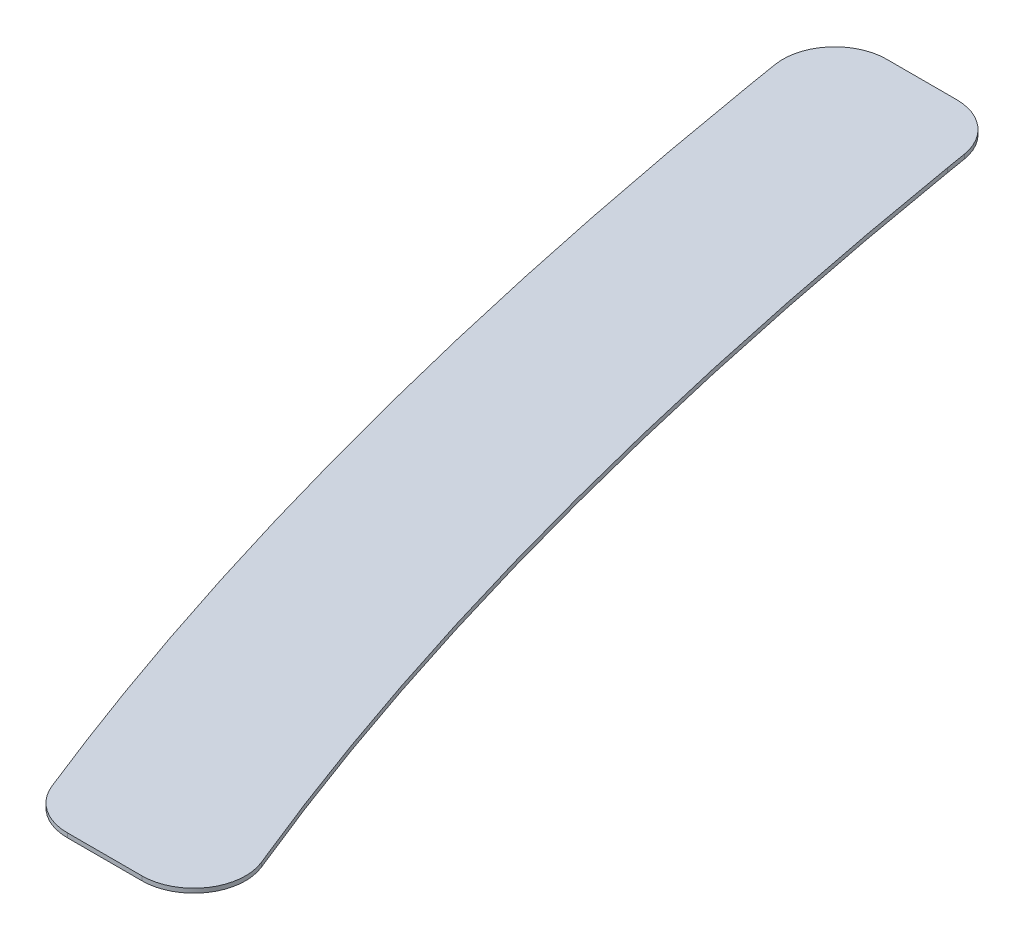
ISO-10303-21;
HEADER;
FILE_DESCRIPTION(('STEP AP214'),'2;1');
FILE_NAME('part.step','',(''),(''),'','','');
FILE_SCHEMA(('AUTOMOTIVE_DESIGN { 1 0 10303 214 1 1 1 1 }'));
ENDSEC;
DATA;
#1=APPLICATION_CONTEXT('core data for automotive mechanical design processes');
#2=APPLICATION_PROTOCOL_DEFINITION('international standard','automotive_design',2000,#1);
#3=PRODUCT_CONTEXT('',#1,'mechanical');
#4=PRODUCT('Part','Part','',(#3));
#5=PRODUCT_RELATED_PRODUCT_CATEGORY('part','',(#4));
#6=PRODUCT_DEFINITION_FORMATION('','',#4);
#7=PRODUCT_DEFINITION_CONTEXT('part definition',#1,'design');
#8=PRODUCT_DEFINITION('design','',#6,#7);
#9=PRODUCT_DEFINITION_SHAPE('','',#8);
#10=(LENGTH_UNIT() NAMED_UNIT(*) SI_UNIT(.MILLI.,.METRE.));
#11=(NAMED_UNIT(*) PLANE_ANGLE_UNIT() SI_UNIT($,.RADIAN.));
#12=(NAMED_UNIT(*) SI_UNIT($,.STERADIAN.) SOLID_ANGLE_UNIT());
#13=UNCERTAINTY_MEASURE_WITH_UNIT(LENGTH_MEASURE(1.E-05),#10,'distance_accuracy_value','');
#14=(GEOMETRIC_REPRESENTATION_CONTEXT(3) GLOBAL_UNCERTAINTY_ASSIGNED_CONTEXT((#13)) GLOBAL_UNIT_ASSIGNED_CONTEXT((#10,
#11,#12)) REPRESENTATION_CONTEXT('',''));
#15=CARTESIAN_POINT('',(0.,0.,0.));
#16=DIRECTION('',(0.,0.,1.));
#17=DIRECTION('',(1.,0.,0.));
#18=AXIS2_PLACEMENT_3D('',#15,#16,#17);
#19=CARTESIAN_POINT('',(856.4780050382,505.5,568.));
#20=DIRECTION('',(0.,1.,0.));
#21=DIRECTION('',(0.,0.,-1.));
#22=AXIS2_PLACEMENT_3D('',#19,#20,#21);
#23=CYLINDRICAL_SURFACE('',#22,12.);
#24=CARTESIAN_POINT('',(856.4780050382,505.,568.));
#25=DIRECTION('',(0.,-1.,0.));
#26=DIRECTION('',(0.,0.,-1.));
#27=AXIS2_PLACEMENT_3D('',#24,#25,#26);
#28=CIRCLE('',#27,12.);
#29=CARTESIAN_POINT('',(856.4780050382,505.,580.));
#30=VERTEX_POINT('',#29);
#31=CARTESIAN_POINT('',(845.340909306832,505.,572.468232163879));
#32=VERTEX_POINT('',#31);
#33=EDGE_CURVE('E67',#30,#32,#28,.T.);
#34=ORIENTED_EDGE('',*,*,#33,.F.);
#35=DIRECTION('',(0.,-1.,0.));
#36=VECTOR('',#35,1.);
#37=CARTESIAN_POINT('',(856.4780050382,505.,580.));
#38=LINE('',#37,#36);
#39=CARTESIAN_POINT('',(856.4780050382,506.,580.));
#40=VERTEX_POINT('',#39);
#41=EDGE_CURVE('E170',#40,#30,#38,.T.);
#42=ORIENTED_EDGE('',*,*,#41,.F.);
#43=CARTESIAN_POINT('',(856.4780050382,506.,568.));
#44=DIRECTION('',(0.,1.,0.));
#45=DIRECTION('',(0.,0.,-1.));
#46=AXIS2_PLACEMENT_3D('',#43,#44,#45);
#47=CIRCLE('',#46,12.);
#48=CARTESIAN_POINT('',(845.340909306832,506.,572.468232163879));
#49=VERTEX_POINT('',#48);
#50=EDGE_CURVE('E163',#49,#40,#47,.T.);
#51=ORIENTED_EDGE('',*,*,#50,.F.);
#52=DIRECTION('',(0.,1.,0.));
#53=VECTOR('',#52,1.);
#54=CARTESIAN_POINT('',(845.340909306832,506.,572.46823216388));
#55=LINE('',#54,#53);
#56=EDGE_CURVE('E197',#32,#49,#55,.T.);
#57=ORIENTED_EDGE('',*,*,#56,.F.);
#58=EDGE_LOOP('',(#34,#42,#51,#57));
#59=FACE_BOUND('',#58,.T.);
#60=ADVANCED_FACE('F17',(#59),#23,.T.);
#61=CARTESIAN_POINT('',(873.746285877886,505.5,568.));
#62=DIRECTION('',(0.,1.,0.));
#63=DIRECTION('',(0.,0.,-1.));
#64=AXIS2_PLACEMENT_3D('',#61,#62,#63);
#65=CYLINDRICAL_SURFACE('',#64,12.);
#66=CARTESIAN_POINT('',(873.746285877886,505.,568.));
#67=DIRECTION('',(0.,-1.,0.));
#68=DIRECTION('',(0.,0.,-1.));
#69=AXIS2_PLACEMENT_3D('',#66,#67,#68);
#70=CIRCLE('',#69,12.);
#71=CARTESIAN_POINT('',(884.845891222246,505.,563.439434114119));
#72=VERTEX_POINT('',#71);
#73=CARTESIAN_POINT('',(873.746285877886,505.,580.));
#74=VERTEX_POINT('',#73);
#75=EDGE_CURVE('E173',#72,#74,#70,.T.);
#76=ORIENTED_EDGE('',*,*,#75,.F.);
#77=DIRECTION('',(0.,-1.,0.));
#78=VECTOR('',#77,1.);
#79=CARTESIAN_POINT('',(884.845891222246,505.,563.439434114119));
#80=LINE('',#79,#78);
#81=CARTESIAN_POINT('',(884.845891222246,506.,563.439434114119));
#82=VERTEX_POINT('',#81);
#83=EDGE_CURVE('E185',#82,#72,#80,.T.);
#84=ORIENTED_EDGE('',*,*,#83,.F.);
#85=CARTESIAN_POINT('',(873.746285877886,506.,568.));
#86=DIRECTION('',(0.,1.,0.));
#87=DIRECTION('',(0.,0.,-1.));
#88=AXIS2_PLACEMENT_3D('',#85,#86,#87);
#89=CIRCLE('',#88,12.);
#90=CARTESIAN_POINT('',(873.746285877886,506.,580.));
#91=VERTEX_POINT('',#90);
#92=EDGE_CURVE('E82',#91,#82,#89,.T.);
#93=ORIENTED_EDGE('',*,*,#92,.F.);
#94=DIRECTION('',(0.,1.,0.));
#95=VECTOR('',#94,1.);
#96=CARTESIAN_POINT('',(873.746285877886,505.,580.));
#97=LINE('',#96,#95);
#98=EDGE_CURVE('E169',#74,#91,#97,.T.);
#99=ORIENTED_EDGE('',*,*,#98,.F.);
#100=EDGE_LOOP('',(#76,#84,#93,#99));
#101=FACE_BOUND('',#100,.T.);
#102=ADVANCED_FACE('F439',(#101),#65,.T.);
#103=CARTESIAN_POINT('',(796.177472469818,505.5,342.));
#104=DIRECTION('',(0.,1.,0.));
#105=DIRECTION('',(0.,0.,-1.));
#106=AXIS2_PLACEMENT_3D('',#103,#104,#105);
#107=CYLINDRICAL_SURFACE('',#106,12.);
#108=CARTESIAN_POINT('',(796.177472469818,505.,342.));
#109=DIRECTION('',(0.,-1.,0.));
#110=DIRECTION('',(0.,0.,-1.));
#111=AXIS2_PLACEMENT_3D('',#108,#109,#110);
#112=CIRCLE('',#111,12.);
#113=CARTESIAN_POINT('',(784.334733832996,505.,343.936373305935));
#114=VERTEX_POINT('',#113);
#115=CARTESIAN_POINT('',(796.177472469818,505.,330.));
#116=VERTEX_POINT('',#115);
#117=EDGE_CURVE('E31',#114,#116,#112,.T.);
#118=ORIENTED_EDGE('',*,*,#117,.F.);
#119=DIRECTION('',(0.,-1.,0.));
#120=VECTOR('',#119,1.);
#121=CARTESIAN_POINT('',(784.334733832994,505.,343.936373305921));
#122=LINE('',#121,#120);
#123=CARTESIAN_POINT('',(784.334733832996,506.,343.936373305935));
#124=VERTEX_POINT('',#123);
#125=EDGE_CURVE('E153',#124,#114,#122,.T.);
#126=ORIENTED_EDGE('',*,*,#125,.F.);
#127=CARTESIAN_POINT('',(796.177472469818,506.,342.));
#128=DIRECTION('',(0.,1.,0.));
#129=DIRECTION('',(0.,0.,-1.));
#130=AXIS2_PLACEMENT_3D('',#127,#128,#129);
#131=CIRCLE('',#130,12.);
#132=CARTESIAN_POINT('',(796.177472469818,506.,330.));
#133=VERTEX_POINT('',#132);
#134=EDGE_CURVE('E123',#133,#124,#131,.T.);
#135=ORIENTED_EDGE('',*,*,#134,.F.);
#136=DIRECTION('',(0.,1.,0.));
#137=VECTOR('',#136,1.);
#138=CARTESIAN_POINT('',(796.177472469818,505.,330.));
#139=LINE('',#138,#137);
#140=EDGE_CURVE('E141',#116,#133,#139,.T.);
#141=ORIENTED_EDGE('',*,*,#140,.F.);
#142=EDGE_LOOP('',(#118,#126,#135,#141));
#143=FACE_BOUND('',#142,.T.);
#144=ADVANCED_FACE('F142',(#143),#107,.T.);
#145=CARTESIAN_POINT('',(812.392486616481,505.5,342.));
#146=DIRECTION('',(0.,1.,0.));
#147=DIRECTION('',(0.,0.,-1.));
#148=AXIS2_PLACEMENT_3D('',#145,#146,#147);
#149=CYLINDRICAL_SURFACE('',#148,12.);
#150=CARTESIAN_POINT('',(812.392486616481,505.,342.));
#151=DIRECTION('',(0.,-1.,0.));
#152=DIRECTION('',(0.,0.,-1.));
#153=AXIS2_PLACEMENT_3D('',#150,#151,#152);
#154=CIRCLE('',#153,12.);
#155=CARTESIAN_POINT('',(812.392486616481,505.,330.));
#156=VERTEX_POINT('',#155);
#157=CARTESIAN_POINT('',(824.23152550379,505.,340.041133433649));
#158=VERTEX_POINT('',#157);
#159=EDGE_CURVE('E11',#156,#158,#154,.T.);
#160=ORIENTED_EDGE('',*,*,#159,.F.);
#161=DIRECTION('',(0.,-1.,0.));
#162=VECTOR('',#161,1.);
#163=CARTESIAN_POINT('',(812.392486616481,505.,330.));
#164=LINE('',#163,#162);
#165=CARTESIAN_POINT('',(812.392486616481,506.,330.));
#166=VERTEX_POINT('',#165);
#167=EDGE_CURVE('E151',#166,#156,#164,.T.);
#168=ORIENTED_EDGE('',*,*,#167,.F.);
#169=CARTESIAN_POINT('',(812.392486616481,506.,342.));
#170=DIRECTION('',(0.,1.,0.));
#171=DIRECTION('',(0.,0.,-1.));
#172=AXIS2_PLACEMENT_3D('',#169,#170,#171);
#173=CIRCLE('',#172,12.);
#174=CARTESIAN_POINT('',(824.23152550379,506.,340.041133433649));
#175=VERTEX_POINT('',#174);
#176=EDGE_CURVE('E171',#175,#166,#173,.T.);
#177=ORIENTED_EDGE('',*,*,#176,.F.);
#178=DIRECTION('',(0.,1.,0.));
#179=VECTOR('',#178,1.);
#180=CARTESIAN_POINT('',(824.231525503791,506.,340.041133433649));
#181=LINE('',#180,#179);
#182=EDGE_CURVE('E191',#158,#175,#181,.T.);
#183=ORIENTED_EDGE('',*,*,#182,.F.);
#184=EDGE_LOOP('',(#160,#168,#177,#183));
#185=FACE_BOUND('',#184,.T.);
#186=ADVANCED_FACE('F422',(#185),#149,.T.);
#187=CARTESIAN_POINT('',(0.,505.,0.));
#188=DIRECTION('',(0.,1.,0.));
#189=DIRECTION('',(1.,0.,0.));
#190=AXIS2_PLACEMENT_3D('',#187,#188,#189);
#191=PLANE('',#190);
#192=CARTESIAN_POINT('',(825.006522365139,505.,344.676532488364));
#193=CARTESIAN_POINT('',(820.180034677245,505.,316.105799526349));
#194=CARTESIAN_POINT('',(815.273194099068,505.,280.231997901681));
#195=CARTESIAN_POINT('',(811.106266200122,505.,240.611100509871));
#196=CARTESIAN_POINT('',(809.718658077188,505.,226.178693766515));
#197=CARTESIAN_POINT('',(806.891459268486,505.,194.858973003472));
#198=CARTESIAN_POINT('',(804.168238169567,505.,155.199510505898));
#199=CARTESIAN_POINT('',(802.317524885658,505.,114.284098854535));
#200=CARTESIAN_POINT('',(801.473615525855,505.,90.2725977588578));
#201=CARTESIAN_POINT('',(801.133355185038,505.,78.1971238869387));
#202=CARTESIAN_POINT('',(800.958659812526,505.,70.9622323715767));
#203=B_SPLINE_CURVE_WITH_KNOTS('',3,(#192,#193,#194,#195,#196,#197,#198,#199,#200,#201,#202),
.UNSPECIFIED.,.F.,.F.,(4,1,1,1,1,1,1,1,4),(0.,0.316086158119462,0.394843191255499,
0.434611216199119,0.474254730428439,0.737897375698214,0.868215493286134,0.921051376030962,1.),.UNSPECIFIED.);
#204=CARTESIAN_POINT('',(825.006522365139,505.,344.676532488364));
#205=VERTEX_POINT('',#204);
#206=EDGE_CURVE('E205',#205,#158,#203,.T.);
#207=ORIENTED_EDGE('',*,*,#206,.F.);
#208=CARTESIAN_POINT('',(1003.47790187698,505.,750.));
#209=CARTESIAN_POINT('',(992.105926782801,505.,738.23099025863));
#210=CARTESIAN_POINT('',(977.346769521141,505.,721.399321829088));
#211=CARTESIAN_POINT('',(956.39364097684,505.,694.171473634577));
#212=CARTESIAN_POINT('',(939.320335597391,505.,669.51622660218));
#213=CARTESIAN_POINT('',(923.844740427881,505.,643.841311183101));
#214=CARTESIAN_POINT('',(910.490682875014,505.,619.304553189258));
#215=CARTESIAN_POINT('',(900.72435084607,505.,599.640127057022));
#216=CARTESIAN_POINT('',(892.477568878219,505.,581.473019758271));
#217=CARTESIAN_POINT('',(887.357800806862,505.,569.541557639466));
#218=CARTESIAN_POINT('',(883.558054688417,505.,560.331774609759));
#219=CARTESIAN_POINT('',(872.863834634074,505.,533.518021096127));
#220=CARTESIAN_POINT('',(861.558508139477,505.,500.521160412346));
#221=CARTESIAN_POINT('',(851.105430867338,505.,464.155658786559));
#222=CARTESIAN_POINT('',(845.774013518538,505.,443.954609379996));
#223=CARTESIAN_POINT('',(841.486505540497,505.,426.544472916345));
#224=CARTESIAN_POINT('',(837.483450045872,505.,409.103183332899));
#225=CARTESIAN_POINT('',(833.747456429881,505.,391.621543043858));
#226=CARTESIAN_POINT('',(830.651391723599,505.,376.045663642099));
#227=CARTESIAN_POINT('',(828.273533808435,505.,363.324582214981));
#228=CARTESIAN_POINT('',(826.514492213466,505.,353.489713475438));
#229=CARTESIAN_POINT('',(825.502071576371,505.,347.609970859946));
#230=CARTESIAN_POINT('',(825.006522365139,505.,344.676532488364));
#231=B_SPLINE_CURVE_WITH_KNOTS('',3,(#208,#209,#210,#211,#212,#213,#214,#215,#216,#217,#218,
#219,#220,#221,#222,#223,#224,#225,#226,#227,#228,#229,#230),.UNSPECIFIED.,.F.,.F.,(4,1,1,1,1,1,
1,1,1,1,1,1,1,1,1,1,1,1,1,1,4),(0.,0.109174858766859,0.149174964749524,0.229168613912527,
0.309131138817732,0.349071219994264,0.415514063503558,0.455564034482648,0.482162996773735,
0.50212403697991,0.522032873874803,0.674720927832937,0.734641938065071,0.774442584330625,
0.814093217953892,0.854257193247291,0.893818382109767,0.933348395325739,0.960197672090086,
0.980153045954644,1.),.UNSPECIFIED.);
#232=EDGE_CURVE('E22',#72,#205,#231,.T.);
#233=ORIENTED_EDGE('',*,*,#232,.F.);
#234=ORIENTED_EDGE('',*,*,#75,.T.);
#235=DIRECTION('',(1.,0.,0.));
#236=VECTOR('',#235,1.);
#237=CARTESIAN_POINT('',(0.,505.,580.));
#238=LINE('',#237,#236);
#239=EDGE_CURVE('E165',#30,#74,#238,.T.);
#240=ORIENTED_EDGE('',*,*,#239,.F.);
#241=ORIENTED_EDGE('',*,*,#33,.T.);
#242=CARTESIAN_POINT('',(785.565207915593,505.,351.339849535134));
#243=CARTESIAN_POINT('',(788.978424366858,505.,371.541131576573));
#244=CARTESIAN_POINT('',(794.359907220215,505.,399.763628532244));
#245=CARTESIAN_POINT('',(802.080298613391,505.,433.808652235915));
#246=CARTESIAN_POINT('',(807.010345899914,505.,453.831651078258));
#247=CARTESIAN_POINT('',(811.756904933394,505.,471.814735959559));
#248=CARTESIAN_POINT('',(816.258267212226,505.,487.736915010618));
#249=CARTESIAN_POINT('',(821.013206386271,505.,503.624479559208));
#250=CARTESIAN_POINT('',(826.037331500085,505.,519.493232672379));
#251=CARTESIAN_POINT('',(831.386466490733,505.,535.280580154532));
#252=CARTESIAN_POINT('',(835.961614997108,505.,548.041779910277));
#253=CARTESIAN_POINT('',(839.606242102918,505.,557.816290796022));
#254=CARTESIAN_POINT('',(845.299994293779,505.,572.580742200096));
#255=CARTESIAN_POINT('',(854.705502760165,505.,595.38274812104));
#256=CARTESIAN_POINT('',(864.878708233502,505.,617.371719998699));
#257=CARTESIAN_POINT('',(875.732647086845,505.,639.028907763579));
#258=CARTESIAN_POINT('',(883.021464626893,505.,652.65793836365));
#259=CARTESIAN_POINT('',(890.950116031723,505.,666.49211748031));
#260=CARTESIAN_POINT('',(895.844019837568,505.,674.741572245518));
#261=CARTESIAN_POINT('',(900.870928336081,505.,682.928791147231));
#262=CARTESIAN_POINT('',(906.026129482516,505.,691.040701027744));
#263=CARTESIAN_POINT('',(910.730648345717,505.,698.191566717435));
#264=CARTESIAN_POINT('',(915.533414579631,505.,705.283306887266));
#265=CARTESIAN_POINT('',(920.439413386482,505.,712.320573569399));
#266=CARTESIAN_POINT('',(927.357452401453,505.,721.903253368827));
#267=CARTESIAN_POINT('',(935.596348013565,505.,732.796931963177));
#268=CARTESIAN_POINT('',(943.517373824289,505.,742.692036027472));
#269=CARTESIAN_POINT('',(948.181651482879,505.,748.290896013329));
#270=CARTESIAN_POINT('',(949.622839074963,505.,750.));
#271=B_SPLINE_CURVE_WITH_KNOTS('',3,(#242,#243,#244,#245,#246,#247,#248,#249,#250,#251,#252,
#253,#254,#255,#256,#257,#258,#259,#260,#261,#262,#263,#264,#265,#266,#267,#268,#269,#270),
.UNSPECIFIED.,.F.,.F.,(4,1,1,1,1,1,1,1,1,1,1,1,1,1,1,1,1,1,1,1,1,1,1,1,1,1,4),(0.,
0.140881836545801,0.197509325668819,0.240035354624321,0.282674852842225,0.325397505972841,
0.353808608072153,0.396709101608331,0.439849572446622,0.468423989990071,0.48992619063109,
0.511582214469632,0.577235121913066,0.659507952993129,0.678132978355615,0.743810600181206,
0.765760360596102,0.787773712648991,0.809766139114279,0.831821453454349,0.853863286563152,
0.86862326786588,0.890716708241395,0.912850562919186,0.949891724556924,0.98462698273928,1.),.UNSPECIFIED.);
#272=CARTESIAN_POINT('',(785.565207915593,505.,351.339849535134));
#273=VERTEX_POINT('',#272);
#274=EDGE_CURVE('E201',#273,#32,#271,.T.);
#275=ORIENTED_EDGE('',*,*,#274,.F.);
#276=CARTESIAN_POINT('',(760.569499720048,505.,52.5601810505374));
#277=CARTESIAN_POINT('',(761.091505341413,505.,82.6829114913813));
#278=CARTESIAN_POINT('',(762.432290422846,505.,123.425369651162));
#279=CARTESIAN_POINT('',(765.217645154549,505.,170.811171866914));
#280=CARTESIAN_POINT('',(766.724623605165,505.,192.135662672798));
#281=CARTESIAN_POINT('',(770.306874271752,505.,237.764615563687));
#282=CARTESIAN_POINT('',(775.340366220356,505.,284.667949879056));
#283=CARTESIAN_POINT('',(781.990567226446,505.,329.322734262035));
#284=CARTESIAN_POINT('',(784.118831957731,505.,342.658805357965));
#285=CARTESIAN_POINT('',(785.00130578463,505.,348.002368260799));
#286=CARTESIAN_POINT('',(785.565207915593,505.,351.339849535134));
#287=B_SPLINE_CURVE_WITH_KNOTS('',3,(#276,#277,#278,#279,#280,#281,#282,#283,#284,#285,#286),
.UNSPECIFIED.,.F.,.F.,(4,1,1,1,1,1,1,1,4),(0.,0.301175313927396,0.407439214767169,
0.474505160891021,0.514874093629566,0.864991867765046,0.945862406011145,0.966162130211192,1.),.UNSPECIFIED.);
#288=EDGE_CURVE('E136',#114,#273,#287,.T.);
#289=ORIENTED_EDGE('',*,*,#288,.F.);
#290=ORIENTED_EDGE('',*,*,#117,.T.);
#291=DIRECTION('',(-1.,0.,0.));
#292=VECTOR('',#291,1.);
#293=CARTESIAN_POINT('',(0.,505.,330.));
#294=LINE('',#293,#292);
#295=EDGE_CURVE('E134',#156,#116,#294,.T.);
#296=ORIENTED_EDGE('',*,*,#295,.F.);
#297=ORIENTED_EDGE('',*,*,#159,.T.);
#298=EDGE_LOOP('',(#207,#233,#234,#240,#241,#275,#289,#290,#296,#297));
#299=FACE_BOUND('',#298,.T.);
#300=ADVANCED_FACE('F132',(#299),#191,.F.);
#301=CARTESIAN_POINT('',(0.,506.,0.));
#302=DIRECTION('',(0.,1.,0.));
#303=DIRECTION('',(1.,0.,0.));
#304=AXIS2_PLACEMENT_3D('',#301,#302,#303);
#305=PLANE('',#304);
#306=DIRECTION('',(-1.,0.,0.));
#307=VECTOR('',#306,1.);
#308=CARTESIAN_POINT('',(0.,506.,330.));
#309=LINE('',#308,#307);
#310=EDGE_CURVE('E146',#166,#133,#309,.T.);
#311=ORIENTED_EDGE('',*,*,#310,.T.);
#312=ORIENTED_EDGE('',*,*,#134,.T.);
#313=CARTESIAN_POINT('',(760.569499720048,506.,52.5601810505374));
#314=CARTESIAN_POINT('',(761.091505341413,506.,82.6829114913813));
#315=CARTESIAN_POINT('',(762.432290422846,506.,123.425369651162));
#316=CARTESIAN_POINT('',(765.217645154549,506.,170.811171866914));
#317=CARTESIAN_POINT('',(766.724623605165,506.,192.135662672798));
#318=CARTESIAN_POINT('',(770.306874271752,506.,237.764615563687));
#319=CARTESIAN_POINT('',(775.340366220356,506.,284.667949879056));
#320=CARTESIAN_POINT('',(781.990567226446,506.,329.322734262035));
#321=CARTESIAN_POINT('',(784.118831957731,506.,342.658805357965));
#322=CARTESIAN_POINT('',(785.00130578463,506.,348.002368260799));
#323=CARTESIAN_POINT('',(785.565207915593,506.,351.339849535134));
#324=B_SPLINE_CURVE_WITH_KNOTS('',3,(#313,#314,#315,#316,#317,#318,#319,#320,#321,#322,#323),
.UNSPECIFIED.,.F.,.F.,(4,1,1,1,1,1,1,1,4),(0.,0.301175313927396,0.407439214767169,
0.474505160891021,0.514874093629566,0.864991867765046,0.945862406011145,0.966162130211192,1.),.UNSPECIFIED.);
#325=CARTESIAN_POINT('',(785.565207915593,506.,351.339849535134));
#326=VERTEX_POINT('',#325);
#327=EDGE_CURVE('E159',#124,#326,#324,.T.);
#328=ORIENTED_EDGE('',*,*,#327,.T.);
#329=CARTESIAN_POINT('',(785.565207915593,506.,351.339849535134));
#330=CARTESIAN_POINT('',(788.978424366858,506.,371.541131576573));
#331=CARTESIAN_POINT('',(794.359907220215,506.,399.763628532244));
#332=CARTESIAN_POINT('',(802.080298613391,506.,433.808652235915));
#333=CARTESIAN_POINT('',(807.010345899914,506.,453.831651078258));
#334=CARTESIAN_POINT('',(811.756904933394,506.,471.814735959559));
#335=CARTESIAN_POINT('',(816.258267212226,506.,487.736915010618));
#336=CARTESIAN_POINT('',(821.013206386271,506.,503.624479559208));
#337=CARTESIAN_POINT('',(826.037331500085,506.,519.493232672379));
#338=CARTESIAN_POINT('',(831.386466490733,506.,535.280580154532));
#339=CARTESIAN_POINT('',(835.961614997108,506.,548.041779910277));
#340=CARTESIAN_POINT('',(839.606242102918,506.,557.816290796022));
#341=CARTESIAN_POINT('',(845.299994293779,506.,572.580742200096));
#342=CARTESIAN_POINT('',(854.705502760165,506.,595.38274812104));
#343=CARTESIAN_POINT('',(864.878708233502,506.,617.371719998699));
#344=CARTESIAN_POINT('',(875.732647086845,506.,639.028907763579));
#345=CARTESIAN_POINT('',(883.021464626893,506.,652.65793836365));
#346=CARTESIAN_POINT('',(890.950116031723,506.,666.49211748031));
#347=CARTESIAN_POINT('',(895.844019837568,506.,674.741572245518));
#348=CARTESIAN_POINT('',(900.870928336081,506.,682.928791147231));
#349=CARTESIAN_POINT('',(906.026129482516,506.,691.040701027744));
#350=CARTESIAN_POINT('',(910.730648345717,506.,698.191566717435));
#351=CARTESIAN_POINT('',(915.533414579631,506.,705.283306887266));
#352=CARTESIAN_POINT('',(920.439413386482,506.,712.320573569399));
#353=CARTESIAN_POINT('',(927.357452401453,506.,721.903253368827));
#354=CARTESIAN_POINT('',(935.596348013565,506.,732.796931963177));
#355=CARTESIAN_POINT('',(943.517373824289,506.,742.692036027472));
#356=CARTESIAN_POINT('',(948.181651482879,506.,748.290896013329));
#357=CARTESIAN_POINT('',(949.622839074963,506.,750.));
#358=B_SPLINE_CURVE_WITH_KNOTS('',3,(#329,#330,#331,#332,#333,#334,#335,#336,#337,#338,#339,
#340,#341,#342,#343,#344,#345,#346,#347,#348,#349,#350,#351,#352,#353,#354,#355,#356,#357),
.UNSPECIFIED.,.F.,.F.,(4,1,1,1,1,1,1,1,1,1,1,1,1,1,1,1,1,1,1,1,1,1,1,1,1,1,4),(0.,
0.140881836545801,0.197509325668819,0.240035354624321,0.282674852842225,0.325397505972841,
0.353808608072153,0.396709101608331,0.439849572446622,0.468423989990071,0.48992619063109,
0.511582214469632,0.577235121913066,0.659507952993129,0.678132978355615,0.743810600181206,
0.765760360596102,0.787773712648991,0.809766139114279,0.831821453454349,0.853863286563152,
0.86862326786588,0.890716708241395,0.912850562919186,0.949891724556924,0.98462698273928,1.),.UNSPECIFIED.);
#359=EDGE_CURVE('E179',#326,#49,#358,.T.);
#360=ORIENTED_EDGE('',*,*,#359,.T.);
#361=ORIENTED_EDGE('',*,*,#50,.T.);
#362=DIRECTION('',(1.,0.,0.));
#363=VECTOR('',#362,1.);
#364=CARTESIAN_POINT('',(0.,506.,580.));
#365=LINE('',#364,#363);
#366=EDGE_CURVE('E182',#40,#91,#365,.T.);
#367=ORIENTED_EDGE('',*,*,#366,.T.);
#368=ORIENTED_EDGE('',*,*,#92,.T.);
#369=CARTESIAN_POINT('',(1003.47790187698,506.,750.));
#370=CARTESIAN_POINT('',(992.105926782801,506.,738.23099025863));
#371=CARTESIAN_POINT('',(977.346769521141,506.,721.399321829088));
#372=CARTESIAN_POINT('',(956.39364097684,506.,694.171473634577));
#373=CARTESIAN_POINT('',(939.320335597391,506.,669.51622660218));
#374=CARTESIAN_POINT('',(923.844740427881,506.,643.841311183101));
#375=CARTESIAN_POINT('',(910.490682875014,506.,619.304553189258));
#376=CARTESIAN_POINT('',(900.72435084607,506.,599.640127057022));
#377=CARTESIAN_POINT('',(892.477568878219,506.,581.473019758271));
#378=CARTESIAN_POINT('',(887.357800806862,506.,569.541557639466));
#379=CARTESIAN_POINT('',(883.558054688417,506.,560.331774609759));
#380=CARTESIAN_POINT('',(872.863834634074,506.,533.518021096127));
#381=CARTESIAN_POINT('',(861.558508139477,506.,500.521160412346));
#382=CARTESIAN_POINT('',(851.105430867338,506.,464.155658786559));
#383=CARTESIAN_POINT('',(845.774013518538,506.,443.954609379996));
#384=CARTESIAN_POINT('',(841.486505540497,506.,426.544472916345));
#385=CARTESIAN_POINT('',(837.483450045872,506.,409.103183332899));
#386=CARTESIAN_POINT('',(833.747456429881,506.,391.621543043858));
#387=CARTESIAN_POINT('',(830.651391723599,506.,376.045663642099));
#388=CARTESIAN_POINT('',(828.273533808435,506.,363.324582214981));
#389=CARTESIAN_POINT('',(826.514492213466,506.,353.489713475438));
#390=CARTESIAN_POINT('',(825.502071576371,506.,347.609970859946));
#391=CARTESIAN_POINT('',(825.006522365139,506.,344.676532488364));
#392=B_SPLINE_CURVE_WITH_KNOTS('',3,(#369,#370,#371,#372,#373,#374,#375,#376,#377,#378,#379,
#380,#381,#382,#383,#384,#385,#386,#387,#388,#389,#390,#391),.UNSPECIFIED.,.F.,.F.,(4,1,1,1,1,1,
1,1,1,1,1,1,1,1,1,1,1,1,1,1,4),(0.,0.109174858766859,0.149174964749524,0.229168613912527,
0.309131138817732,0.349071219994264,0.415514063503558,0.455564034482648,0.482162996773735,
0.50212403697991,0.522032873874803,0.674720927832937,0.734641938065071,0.774442584330625,
0.814093217953892,0.854257193247291,0.893818382109767,0.933348395325739,0.960197672090086,
0.980153045954644,1.),.UNSPECIFIED.);
#393=CARTESIAN_POINT('',(825.006522365139,506.,344.676532488364));
#394=VERTEX_POINT('',#393);
#395=EDGE_CURVE('E196',#82,#394,#392,.T.);
#396=ORIENTED_EDGE('',*,*,#395,.T.);
#397=CARTESIAN_POINT('',(825.006522365139,506.,344.676532488364));
#398=CARTESIAN_POINT('',(820.180034677245,506.,316.105799526349));
#399=CARTESIAN_POINT('',(815.273194099068,506.,280.231997901681));
#400=CARTESIAN_POINT('',(811.106266200122,506.,240.611100509871));
#401=CARTESIAN_POINT('',(809.718658077188,506.,226.178693766515));
#402=CARTESIAN_POINT('',(806.891459268486,506.,194.858973003472));
#403=CARTESIAN_POINT('',(804.168238169567,506.,155.199510505898));
#404=CARTESIAN_POINT('',(802.317524885658,506.,114.284098854535));
#405=CARTESIAN_POINT('',(801.473615525855,506.,90.2725977588578));
#406=CARTESIAN_POINT('',(801.133355185038,506.,78.1971238869387));
#407=CARTESIAN_POINT('',(800.958659812526,506.,70.9622323715767));
#408=B_SPLINE_CURVE_WITH_KNOTS('',3,(#397,#398,#399,#400,#401,#402,#403,#404,#405,#406,#407),
.UNSPECIFIED.,.F.,.F.,(4,1,1,1,1,1,1,1,4),(0.,0.316086158119462,0.394843191255499,
0.434611216199119,0.474254730428439,0.737897375698214,0.868215493286134,0.921051376030962,1.),.UNSPECIFIED.);
#409=EDGE_CURVE('E211',#394,#175,#408,.T.);
#410=ORIENTED_EDGE('',*,*,#409,.T.);
#411=ORIENTED_EDGE('',*,*,#176,.T.);
#412=EDGE_LOOP('',(#311,#312,#328,#360,#361,#367,#368,#396,#410,#411));
#413=FACE_BOUND('',#412,.T.);
#414=ADVANCED_FACE('F404',(#413),#305,.T.);
#415=CARTESIAN_POINT('',(825.006522365139,505.,344.676532488364));
#416=CARTESIAN_POINT('',(820.180034677245,505.,316.105799526349));
#417=CARTESIAN_POINT('',(815.273194099068,505.,280.231997901681));
#418=CARTESIAN_POINT('',(811.106266200122,505.,240.611100509871));
#419=CARTESIAN_POINT('',(809.718658077188,505.,226.178693766515));
#420=CARTESIAN_POINT('',(806.891459268486,505.,194.858973003472));
#421=CARTESIAN_POINT('',(804.168238169567,505.,155.199510505898));
#422=CARTESIAN_POINT('',(802.317524885658,505.,114.284098854535));
#423=CARTESIAN_POINT('',(801.473615525855,505.,90.2725977588578));
#424=CARTESIAN_POINT('',(801.133355185038,505.,78.1971238869387));
#425=CARTESIAN_POINT('',(800.958659812526,505.,70.9622323715767));
#426=(BOUNDED_CURVE() B_SPLINE_CURVE(3,(#415,#416,#417,#418,#419,#420,#421,#422,#423,#424,#425),
.UNSPECIFIED.,.F.,.F.) B_SPLINE_CURVE_WITH_KNOTS((4,1,1,1,1,1,1,1,4),(0.,0.316086158119462,
0.394843191255499,0.434611216199119,0.474254730428439,0.737897375698214,0.868215493286134,
0.921051376030962,1.),
.UNSPECIFIED.) CURVE() GEOMETRIC_REPRESENTATION_ITEM() RATIONAL_B_SPLINE_CURVE((1.,1.,1.,1.,1.,
1.,1.,1.,1.,1.,1.)) REPRESENTATION_ITEM(''));
#427=DIRECTION('',(0.,1.,0.));
#428=VECTOR('',#427,1.);
#429=SURFACE_OF_LINEAR_EXTRUSION('',#426,#428);
#430=ORIENTED_EDGE('',*,*,#409,.F.);
#431=DIRECTION('',(0.,-1.,0.));
#432=VECTOR('',#431,1.);
#433=CARTESIAN_POINT('',(825.006522365139,505.,344.676532488364));
#434=LINE('',#433,#432);
#435=EDGE_CURVE('E192',#394,#205,#434,.T.);
#436=ORIENTED_EDGE('',*,*,#435,.T.);
#437=ORIENTED_EDGE('',*,*,#206,.T.);
#438=ORIENTED_EDGE('',*,*,#182,.T.);
#439=EDGE_LOOP('',(#430,#436,#437,#438));
#440=FACE_BOUND('',#439,.T.);
#441=ADVANCED_FACE('F19',(#440),#429,.T.);
#442=CARTESIAN_POINT('',(0.,505.,330.));
#443=DIRECTION('',(0.,0.,1.));
#444=DIRECTION('',(1.,0.,0.));
#445=AXIS2_PLACEMENT_3D('',#442,#443,#444);
#446=PLANE('',#445);
#447=ORIENTED_EDGE('',*,*,#295,.T.);
#448=ORIENTED_EDGE('',*,*,#140,.T.);
#449=ORIENTED_EDGE('',*,*,#310,.F.);
#450=ORIENTED_EDGE('',*,*,#167,.T.);
#451=EDGE_LOOP('',(#447,#448,#449,#450));
#452=FACE_BOUND('',#451,.T.);
#453=ADVANCED_FACE('F149',(#452),#446,.F.);
#454=CARTESIAN_POINT('',(785.565207915593,505.,351.339849535134));
#455=CARTESIAN_POINT('',(785.00130578463,505.,348.002368260799));
#456=CARTESIAN_POINT('',(784.118831957731,505.,342.658805357965));
#457=CARTESIAN_POINT('',(781.990567226446,505.,329.322734262035));
#458=CARTESIAN_POINT('',(775.340366220356,505.,284.667949879056));
#459=CARTESIAN_POINT('',(770.306874271752,505.,237.764615563687));
#460=CARTESIAN_POINT('',(766.724623605165,505.,192.135662672798));
#461=CARTESIAN_POINT('',(765.217645154549,505.,170.811171866914));
#462=CARTESIAN_POINT('',(762.432290422846,505.,123.425369651162));
#463=CARTESIAN_POINT('',(761.091505341413,505.,82.6829114913813));
#464=CARTESIAN_POINT('',(760.569499720048,505.,52.5601810505374));
#465=(BOUNDED_CURVE() B_SPLINE_CURVE(3,(#454,#455,#456,#457,#458,#459,#460,#461,#462,#463,#464),
.UNSPECIFIED.,.F.,.F.) B_SPLINE_CURVE_WITH_KNOTS((4,1,1,1,1,1,1,1,4),(0.,0.0338378697888083,
0.0541375939888553,0.135008132234954,0.485125906370434,0.525494839108979,0.592560785232831,
0.698824686072604,1.),
.UNSPECIFIED.) CURVE() GEOMETRIC_REPRESENTATION_ITEM() RATIONAL_B_SPLINE_CURVE((1.,1.,1.,1.,1.,
1.,1.,1.,1.,1.,1.)) REPRESENTATION_ITEM(''));
#466=DIRECTION('',(0.,1.,0.));
#467=VECTOR('',#466,1.);
#468=SURFACE_OF_LINEAR_EXTRUSION('',#465,#467);
#469=ORIENTED_EDGE('',*,*,#288,.T.);
#470=DIRECTION('',(0.,-1.,0.));
#471=VECTOR('',#470,1.);
#472=CARTESIAN_POINT('',(785.565207915593,505.,351.339849535134));
#473=LINE('',#472,#471);
#474=EDGE_CURVE('E242',#326,#273,#473,.T.);
#475=ORIENTED_EDGE('',*,*,#474,.F.);
#476=ORIENTED_EDGE('',*,*,#327,.F.);
#477=ORIENTED_EDGE('',*,*,#125,.T.);
#478=EDGE_LOOP('',(#469,#475,#476,#477));
#479=FACE_BOUND('',#478,.T.);
#480=ADVANCED_FACE('F379',(#479),#468,.F.);
#481=CARTESIAN_POINT('',(949.622839074963,505.,750.));
#482=CARTESIAN_POINT('',(948.181651482879,505.,748.290896013329));
#483=CARTESIAN_POINT('',(943.517373824289,505.,742.692036027472));
#484=CARTESIAN_POINT('',(935.596348013565,505.,732.796931963177));
#485=CARTESIAN_POINT('',(927.357452401453,505.,721.903253368827));
#486=CARTESIAN_POINT('',(920.439413386482,505.,712.320573569399));
#487=CARTESIAN_POINT('',(915.533414579631,505.,705.283306887266));
#488=CARTESIAN_POINT('',(910.730648345717,505.,698.191566717435));
#489=CARTESIAN_POINT('',(906.026129482516,505.,691.040701027744));
#490=CARTESIAN_POINT('',(900.870928336081,505.,682.928791147231));
#491=CARTESIAN_POINT('',(895.844019837568,505.,674.741572245518));
#492=CARTESIAN_POINT('',(890.950116031723,505.,666.49211748031));
#493=CARTESIAN_POINT('',(883.021464626893,505.,652.65793836365));
#494=CARTESIAN_POINT('',(875.732647086845,505.,639.028907763579));
#495=CARTESIAN_POINT('',(864.878708233502,505.,617.371719998699));
#496=CARTESIAN_POINT('',(854.705502760165,505.,595.38274812104));
#497=CARTESIAN_POINT('',(845.299994293779,505.,572.580742200096));
#498=CARTESIAN_POINT('',(839.606242102918,505.,557.816290796022));
#499=CARTESIAN_POINT('',(835.961614997108,505.,548.041779910277));
#500=CARTESIAN_POINT('',(831.386466490733,505.,535.280580154532));
#501=CARTESIAN_POINT('',(826.037331500085,505.,519.493232672379));
#502=CARTESIAN_POINT('',(821.013206386271,505.,503.624479559208));
#503=CARTESIAN_POINT('',(816.258267212226,505.,487.736915010618));
#504=CARTESIAN_POINT('',(811.756904933394,505.,471.814735959559));
#505=CARTESIAN_POINT('',(807.010345899914,505.,453.831651078258));
#506=CARTESIAN_POINT('',(802.080298613391,505.,433.808652235915));
#507=CARTESIAN_POINT('',(794.359907220215,505.,399.763628532244));
#508=CARTESIAN_POINT('',(788.978424366858,505.,371.541131576573));
#509=CARTESIAN_POINT('',(785.565207915593,505.,351.339849535134));
#510=(BOUNDED_CURVE() B_SPLINE_CURVE(3,(#481,#482,#483,#484,#485,#486,#487,#488,#489,#490,#491,
#492,#493,#494,#495,#496,#497,#498,#499,#500,#501,#502,#503,#504,#505,#506,#507,#508,#509),
.UNSPECIFIED.,.F.,.F.) B_SPLINE_CURVE_WITH_KNOTS((4,1,1,1,1,1,1,1,1,1,1,1,1,1,1,1,1,1,1,1,1,1,1,
1,1,1,4),(0.,0.0153730172607203,0.0501082754430755,0.0871494370808145,0.109283291758605,
0.13137673213412,0.146136713436848,0.168178546545651,0.190233860885721,0.212226287351009,
0.234239639403898,0.256189399818794,0.321867021644385,0.340492047006871,0.422764878086934,
0.488417785530368,0.51007380936891,0.531576010009929,0.560150427553378,0.603290898391669,
0.646191391927847,0.674602494027159,0.717325147157775,0.759964645375679,0.802490674331181,
0.859118163454199,1.),
.UNSPECIFIED.) CURVE() GEOMETRIC_REPRESENTATION_ITEM() RATIONAL_B_SPLINE_CURVE((1.,1.,1.,1.,1.,
1.,1.,1.,1.,1.,1.,1.,1.,1.,1.,1.,1.,1.,1.,1.,1.,1.,1.,1.,1.,1.,1.,1.,1.)) REPRESENTATION_ITEM(''));
#511=DIRECTION('',(0.,1.,0.));
#512=VECTOR('',#511,1.);
#513=SURFACE_OF_LINEAR_EXTRUSION('',#510,#512);
#514=ORIENTED_EDGE('',*,*,#359,.F.);
#515=ORIENTED_EDGE('',*,*,#474,.T.);
#516=ORIENTED_EDGE('',*,*,#274,.T.);
#517=ORIENTED_EDGE('',*,*,#56,.T.);
#518=EDGE_LOOP('',(#514,#515,#516,#517));
#519=FACE_BOUND('',#518,.T.);
#520=ADVANCED_FACE('F368',(#519),#513,.F.);
#521=CARTESIAN_POINT('',(0.,505.,580.));
#522=DIRECTION('',(0.,0.,1.));
#523=DIRECTION('',(1.,0.,0.));
#524=AXIS2_PLACEMENT_3D('',#521,#522,#523);
#525=PLANE('',#524);
#526=ORIENTED_EDGE('',*,*,#366,.F.);
#527=ORIENTED_EDGE('',*,*,#41,.T.);
#528=ORIENTED_EDGE('',*,*,#239,.T.);
#529=ORIENTED_EDGE('',*,*,#98,.T.);
#530=EDGE_LOOP('',(#526,#527,#528,#529));
#531=FACE_BOUND('',#530,.T.);
#532=ADVANCED_FACE('F356',(#531),#525,.T.);
#533=CARTESIAN_POINT('',(1003.47790187698,505.,750.));
#534=CARTESIAN_POINT('',(992.105926782801,505.,738.23099025863));
#535=CARTESIAN_POINT('',(977.346769521141,505.,721.399321829088));
#536=CARTESIAN_POINT('',(956.39364097684,505.,694.171473634577));
#537=CARTESIAN_POINT('',(939.320335597391,505.,669.51622660218));
#538=CARTESIAN_POINT('',(923.844740427881,505.,643.841311183101));
#539=CARTESIAN_POINT('',(910.490682875014,505.,619.304553189258));
#540=CARTESIAN_POINT('',(900.72435084607,505.,599.640127057022));
#541=CARTESIAN_POINT('',(892.477568878219,505.,581.473019758271));
#542=CARTESIAN_POINT('',(887.357800806862,505.,569.541557639466));
#543=CARTESIAN_POINT('',(883.558054688417,505.,560.331774609759));
#544=CARTESIAN_POINT('',(872.863834634074,505.,533.518021096127));
#545=CARTESIAN_POINT('',(861.558508139477,505.,500.521160412346));
#546=CARTESIAN_POINT('',(851.105430867338,505.,464.155658786559));
#547=CARTESIAN_POINT('',(845.774013518538,505.,443.954609379996));
#548=CARTESIAN_POINT('',(841.486505540497,505.,426.544472916345));
#549=CARTESIAN_POINT('',(837.483450045872,505.,409.103183332899));
#550=CARTESIAN_POINT('',(833.747456429881,505.,391.621543043858));
#551=CARTESIAN_POINT('',(830.651391723599,505.,376.045663642099));
#552=CARTESIAN_POINT('',(828.273533808435,505.,363.324582214981));
#553=CARTESIAN_POINT('',(826.514492213466,505.,353.489713475438));
#554=CARTESIAN_POINT('',(825.502071576371,505.,347.609970859946));
#555=CARTESIAN_POINT('',(825.006522365139,505.,344.676532488364));
#556=(BOUNDED_CURVE() B_SPLINE_CURVE(3,(#533,#534,#535,#536,#537,#538,#539,#540,#541,#542,#543,
#544,#545,#546,#547,#548,#549,#550,#551,#552,#553,#554,#555),.UNSPECIFIED.,.F.,
.F.) B_SPLINE_CURVE_WITH_KNOTS((4,1,1,1,1,1,1,1,1,1,1,1,1,1,1,1,1,1,1,1,4),(0.,
0.109174858766859,0.149174964749524,0.229168613912527,0.309131138817732,0.349071219994264,
0.415514063503558,0.455564034482648,0.482162996773735,0.50212403697991,0.522032873874803,
0.674720927832937,0.734641938065071,0.774442584330625,0.814093217953892,0.854257193247291,
0.893818382109767,0.933348395325739,0.960197672090086,0.980153045954644,1.),
.UNSPECIFIED.) CURVE() GEOMETRIC_REPRESENTATION_ITEM() RATIONAL_B_SPLINE_CURVE((1.,1.,1.,1.,1.,
1.,1.,1.,1.,1.,1.,1.,1.,1.,1.,1.,1.,1.,1.,1.,1.,1.,1.)) REPRESENTATION_ITEM(''));
#557=DIRECTION('',(0.,1.,0.));
#558=VECTOR('',#557,1.);
#559=SURFACE_OF_LINEAR_EXTRUSION('',#556,#558);
#560=ORIENTED_EDGE('',*,*,#232,.T.);
#561=ORIENTED_EDGE('',*,*,#435,.F.);
#562=ORIENTED_EDGE('',*,*,#395,.F.);
#563=ORIENTED_EDGE('',*,*,#83,.T.);
#564=EDGE_LOOP('',(#560,#561,#562,#563));
#565=FACE_BOUND('',#564,.T.);
#566=ADVANCED_FACE('F350',(#565),#559,.T.);
#567=CLOSED_SHELL('',(#60,#102,#144,#186,#300,#414,#441,#453,#480,#520,#532,#566));
#568=MANIFOLD_SOLID_BREP('B1',#567);
#569=ADVANCED_BREP_SHAPE_REPRESENTATION('',(#18,#568),#14);
#570=SHAPE_DEFINITION_REPRESENTATION(#9,#569);
ENDSEC;
END-ISO-10303-21;
